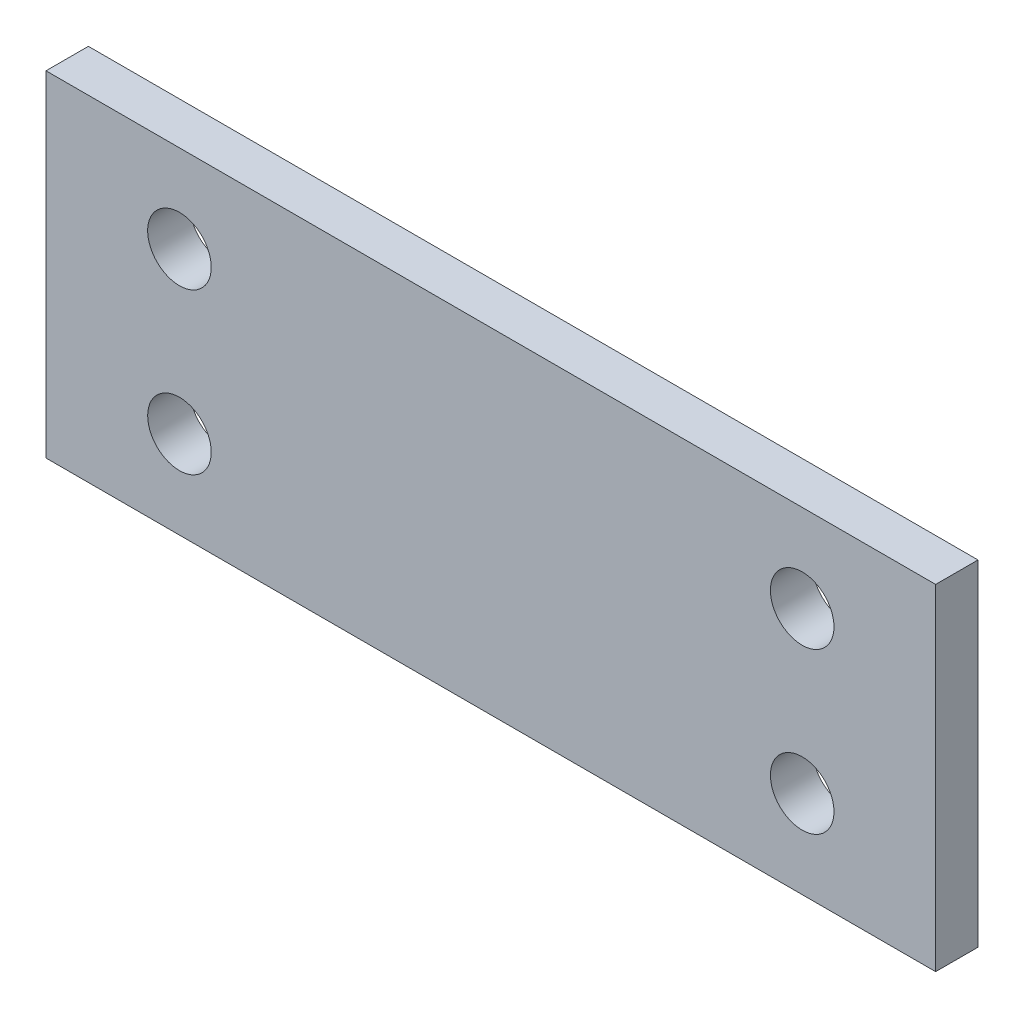
ISO-10303-21;
HEADER;
FILE_DESCRIPTION(('STEP AP214'),'2;1');
FILE_NAME('part.step','',(''),(''),'','','');
FILE_SCHEMA(('AUTOMOTIVE_DESIGN { 1 0 10303 214 1 1 1 1 }'));
ENDSEC;
DATA;
#1=APPLICATION_CONTEXT('core data for automotive mechanical design processes');
#2=APPLICATION_PROTOCOL_DEFINITION('international standard','automotive_design',2000,#1);
#3=PRODUCT_CONTEXT('',#1,'mechanical');
#4=PRODUCT('Part','Part','',(#3));
#5=PRODUCT_RELATED_PRODUCT_CATEGORY('part','',(#4));
#6=PRODUCT_DEFINITION_FORMATION('','',#4);
#7=PRODUCT_DEFINITION_CONTEXT('part definition',#1,'design');
#8=PRODUCT_DEFINITION('design','',#6,#7);
#9=PRODUCT_DEFINITION_SHAPE('','',#8);
#10=(LENGTH_UNIT() NAMED_UNIT(*) SI_UNIT(.MILLI.,.METRE.));
#11=(NAMED_UNIT(*) PLANE_ANGLE_UNIT() SI_UNIT($,.RADIAN.));
#12=(NAMED_UNIT(*) SI_UNIT($,.STERADIAN.) SOLID_ANGLE_UNIT());
#13=UNCERTAINTY_MEASURE_WITH_UNIT(LENGTH_MEASURE(1.E-05),#10,'distance_accuracy_value','');
#14=(GEOMETRIC_REPRESENTATION_CONTEXT(3) GLOBAL_UNCERTAINTY_ASSIGNED_CONTEXT((#13)) GLOBAL_UNIT_ASSIGNED_CONTEXT((#10,
#11,#12)) REPRESENTATION_CONTEXT('',''));
#15=CARTESIAN_POINT('',(0.,0.,0.));
#16=DIRECTION('',(0.,0.,1.));
#17=DIRECTION('',(1.,0.,0.));
#18=AXIS2_PLACEMENT_3D('',#15,#16,#17);
#19=CARTESIAN_POINT('',(-100.,25.4,9.525));
#20=DIRECTION('',(1.,0.,0.));
#21=DIRECTION('',(0.,1.,0.));
#22=AXIS2_PLACEMENT_3D('',#19,#20,#21);
#23=PLANE('',#22);
#24=DIRECTION('',(0.,-1.,0.));
#25=VECTOR('',#24,1.);
#26=CARTESIAN_POINT('',(-100.,25.4,0.));
#27=LINE('',#26,#25);
#28=CARTESIAN_POINT('',(-100.,25.4,0.));
#29=VERTEX_POINT('',#28);
#30=CARTESIAN_POINT('',(-100.,-50.,0.));
#31=VERTEX_POINT('',#30);
#32=EDGE_CURVE('E101',#29,#31,#27,.T.);
#33=ORIENTED_EDGE('',*,*,#32,.T.);
#34=DIRECTION('',(0.,0.,-1.));
#35=VECTOR('',#34,1.);
#36=CARTESIAN_POINT('',(-100.,-50.,9.525));
#37=LINE('',#36,#35);
#38=CARTESIAN_POINT('',(-100.,-50.,9.525));
#39=VERTEX_POINT('',#38);
#40=EDGE_CURVE('E11',#39,#31,#37,.T.);
#41=ORIENTED_EDGE('',*,*,#40,.F.);
#42=DIRECTION('',(0.,-1.,0.));
#43=VECTOR('',#42,1.);
#44=CARTESIAN_POINT('',(-100.,25.4,9.525));
#45=LINE('',#44,#43);
#46=CARTESIAN_POINT('',(-100.,25.4,9.525));
#47=VERTEX_POINT('',#46);
#48=EDGE_CURVE('E88',#47,#39,#45,.T.);
#49=ORIENTED_EDGE('',*,*,#48,.F.);
#50=DIRECTION('',(0.,0.,-1.));
#51=VECTOR('',#50,1.);
#52=CARTESIAN_POINT('',(-100.,25.4,9.525));
#53=LINE('',#52,#51);
#54=EDGE_CURVE('E97',#47,#29,#53,.T.);
#55=ORIENTED_EDGE('',*,*,#54,.T.);
#56=EDGE_LOOP('',(#33,#41,#49,#55));
#57=FACE_BOUND('',#56,.T.);
#58=ADVANCED_FACE('F35',(#57),#23,.F.);
#59=CARTESIAN_POINT('',(-100.,-50.,9.525));
#60=DIRECTION('',(0.,1.,0.));
#61=DIRECTION('',(0.,0.,1.));
#62=AXIS2_PLACEMENT_3D('',#59,#60,#61);
#63=PLANE('',#62);
#64=DIRECTION('',(1.,0.,0.));
#65=VECTOR('',#64,1.);
#66=CARTESIAN_POINT('',(-100.,-50.,0.));
#67=LINE('',#66,#65);
#68=CARTESIAN_POINT('',(100.,-50.,0.));
#69=VERTEX_POINT('',#68);
#70=EDGE_CURVE('E92',#31,#69,#67,.T.);
#71=ORIENTED_EDGE('',*,*,#70,.T.);
#72=DIRECTION('',(0.,0.,-1.));
#73=VECTOR('',#72,1.);
#74=CARTESIAN_POINT('',(100.,-50.,9.525));
#75=LINE('',#74,#73);
#76=CARTESIAN_POINT('',(100.,-50.,9.525));
#77=VERTEX_POINT('',#76);
#78=EDGE_CURVE('E44',#77,#69,#75,.T.);
#79=ORIENTED_EDGE('',*,*,#78,.F.);
#80=DIRECTION('',(1.,0.,0.));
#81=VECTOR('',#80,1.);
#82=CARTESIAN_POINT('',(-100.,-50.,9.525));
#83=LINE('',#82,#81);
#84=EDGE_CURVE('E83',#39,#77,#83,.T.);
#85=ORIENTED_EDGE('',*,*,#84,.F.);
#86=ORIENTED_EDGE('',*,*,#40,.T.);
#87=EDGE_LOOP('',(#71,#79,#85,#86));
#88=FACE_BOUND('',#87,.T.);
#89=ADVANCED_FACE('F91',(#88),#63,.F.);
#90=CARTESIAN_POINT('',(100.,-50.,9.525));
#91=DIRECTION('',(-1.,0.,0.));
#92=DIRECTION('',(0.,-1.,0.));
#93=AXIS2_PLACEMENT_3D('',#90,#91,#92);
#94=PLANE('',#93);
#95=DIRECTION('',(0.,1.,0.));
#96=VECTOR('',#95,1.);
#97=CARTESIAN_POINT('',(100.,-50.,0.));
#98=LINE('',#97,#96);
#99=CARTESIAN_POINT('',(100.,25.4,0.));
#100=VERTEX_POINT('',#99);
#101=EDGE_CURVE('E70',#69,#100,#98,.T.);
#102=ORIENTED_EDGE('',*,*,#101,.T.);
#103=DIRECTION('',(0.,0.,-1.));
#104=VECTOR('',#103,1.);
#105=CARTESIAN_POINT('',(100.,25.4,9.525));
#106=LINE('',#105,#104);
#107=CARTESIAN_POINT('',(100.,25.4,9.525));
#108=VERTEX_POINT('',#107);
#109=EDGE_CURVE('E93',#108,#100,#106,.T.);
#110=ORIENTED_EDGE('',*,*,#109,.F.);
#111=DIRECTION('',(0.,1.,0.));
#112=VECTOR('',#111,1.);
#113=CARTESIAN_POINT('',(100.,-50.,9.525));
#114=LINE('',#113,#112);
#115=EDGE_CURVE('E86',#77,#108,#114,.T.);
#116=ORIENTED_EDGE('',*,*,#115,.F.);
#117=ORIENTED_EDGE('',*,*,#78,.T.);
#118=EDGE_LOOP('',(#102,#110,#116,#117));
#119=FACE_BOUND('',#118,.T.);
#120=ADVANCED_FACE('F95',(#119),#94,.F.);
#121=CARTESIAN_POINT('',(-100.,25.4,9.525));
#122=DIRECTION('',(0.,-1.,0.));
#123=DIRECTION('',(1.,0.,0.));
#124=AXIS2_PLACEMENT_3D('',#121,#122,#123);
#125=PLANE('',#124);
#126=DIRECTION('',(-1.,0.,0.));
#127=VECTOR('',#126,1.);
#128=CARTESIAN_POINT('',(-100.,25.4,0.));
#129=LINE('',#128,#127);
#130=EDGE_CURVE('E76',#100,#29,#129,.T.);
#131=ORIENTED_EDGE('',*,*,#130,.T.);
#132=ORIENTED_EDGE('',*,*,#54,.F.);
#133=DIRECTION('',(-1.,0.,0.));
#134=VECTOR('',#133,1.);
#135=CARTESIAN_POINT('',(-100.,25.4,9.525));
#136=LINE('',#135,#134);
#137=EDGE_CURVE('E53',#108,#47,#136,.T.);
#138=ORIENTED_EDGE('',*,*,#137,.F.);
#139=ORIENTED_EDGE('',*,*,#109,.T.);
#140=EDGE_LOOP('',(#131,#132,#138,#139));
#141=FACE_BOUND('',#140,.T.);
#142=ADVANCED_FACE('F143',(#141),#125,.F.);
#143=CARTESIAN_POINT('',(0.,0.,9.525));
#144=DIRECTION('',(0.,0.,1.));
#145=DIRECTION('',(1.,0.,0.));
#146=AXIS2_PLACEMENT_3D('',#143,#144,#145);
#147=PLANE('',#146);
#148=CARTESIAN_POINT('',(-70.,-30.3,9.525));
#149=DIRECTION('',(0.,0.,1.));
#150=DIRECTION('',(-1.,0.,0.));
#151=AXIS2_PLACEMENT_3D('',#148,#149,#150);
#152=CIRCLE('',#151,7.14375);
#153=CARTESIAN_POINT('',(-77.14375,-30.3,9.525));
#154=VERTEX_POINT('',#153);
#155=EDGE_CURVE('E116',#154,#154,#152,.T.);
#156=ORIENTED_EDGE('',*,*,#155,.F.);
#157=EDGE_LOOP('',(#156));
#158=FACE_BOUND('',#157,.T.);
#159=CARTESIAN_POINT('',(70.,-30.3,9.525));
#160=DIRECTION('',(0.,0.,1.));
#161=DIRECTION('',(1.,0.,0.));
#162=AXIS2_PLACEMENT_3D('',#159,#160,#161);
#163=CIRCLE('',#162,7.14375);
#164=CARTESIAN_POINT('',(77.14375,-30.3,9.525));
#165=VERTEX_POINT('',#164);
#166=EDGE_CURVE('E131',#165,#165,#163,.T.);
#167=ORIENTED_EDGE('',*,*,#166,.F.);
#168=EDGE_LOOP('',(#167));
#169=FACE_BOUND('',#168,.T.);
#170=CARTESIAN_POINT('',(70.,5.70000000000002,9.525));
#171=DIRECTION('',(0.,0.,1.));
#172=DIRECTION('',(-1.,0.,0.));
#173=AXIS2_PLACEMENT_3D('',#170,#171,#172);
#174=CIRCLE('',#173,7.14375);
#175=CARTESIAN_POINT('',(62.85625,5.70000000000002,9.525));
#176=VERTEX_POINT('',#175);
#177=EDGE_CURVE('E128',#176,#176,#174,.T.);
#178=ORIENTED_EDGE('',*,*,#177,.F.);
#179=EDGE_LOOP('',(#178));
#180=FACE_BOUND('',#179,.T.);
#181=CARTESIAN_POINT('',(-70.,5.69999999999999,9.525));
#182=DIRECTION('',(0.,0.,1.));
#183=DIRECTION('',(1.,0.,0.));
#184=AXIS2_PLACEMENT_3D('',#181,#182,#183);
#185=CIRCLE('',#184,7.14375);
#186=CARTESIAN_POINT('',(-62.85625,5.69999999999999,9.525));
#187=VERTEX_POINT('',#186);
#188=EDGE_CURVE('E112',#187,#187,#185,.T.);
#189=ORIENTED_EDGE('',*,*,#188,.F.);
#190=EDGE_LOOP('',(#189));
#191=FACE_BOUND('',#190,.T.);
#192=ORIENTED_EDGE('',*,*,#48,.T.);
#193=ORIENTED_EDGE('',*,*,#84,.T.);
#194=ORIENTED_EDGE('',*,*,#115,.T.);
#195=ORIENTED_EDGE('',*,*,#137,.T.);
#196=EDGE_LOOP('',(#192,#193,#194,#195));
#197=FACE_BOUND('',#196,.T.);
#198=ADVANCED_FACE('F84',(#158,#169,#180,#191,#197),#147,.T.);
#199=CARTESIAN_POINT('',(0.,0.,0.));
#200=DIRECTION('',(0.,0.,1.));
#201=DIRECTION('',(1.,0.,0.));
#202=AXIS2_PLACEMENT_3D('',#199,#200,#201);
#203=PLANE('',#202);
#204=CARTESIAN_POINT('',(-70.,-30.3,0.));
#205=DIRECTION('',(0.,0.,1.));
#206=DIRECTION('',(1.,0.,0.));
#207=AXIS2_PLACEMENT_3D('',#204,#205,#206);
#208=CIRCLE('',#207,7.14375);
#209=CARTESIAN_POINT('',(-62.85625,-30.3,0.));
#210=VERTEX_POINT('',#209);
#211=EDGE_CURVE('E38',#210,#210,#208,.T.);
#212=ORIENTED_EDGE('',*,*,#211,.T.);
#213=EDGE_LOOP('',(#212));
#214=FACE_BOUND('',#213,.T.);
#215=CARTESIAN_POINT('',(70.,-30.3,0.));
#216=DIRECTION('',(0.,0.,1.));
#217=DIRECTION('',(1.,0.,0.));
#218=AXIS2_PLACEMENT_3D('',#215,#216,#217);
#219=CIRCLE('',#218,7.14375);
#220=CARTESIAN_POINT('',(77.14375,-30.3,0.));
#221=VERTEX_POINT('',#220);
#222=EDGE_CURVE('E115',#221,#221,#219,.T.);
#223=ORIENTED_EDGE('',*,*,#222,.T.);
#224=EDGE_LOOP('',(#223));
#225=FACE_BOUND('',#224,.T.);
#226=CARTESIAN_POINT('',(70.,5.70000000000002,0.));
#227=DIRECTION('',(0.,0.,1.));
#228=DIRECTION('',(1.,0.,0.));
#229=AXIS2_PLACEMENT_3D('',#226,#227,#228);
#230=CIRCLE('',#229,7.14375);
#231=CARTESIAN_POINT('',(77.14375,5.70000000000002,0.));
#232=VERTEX_POINT('',#231);
#233=EDGE_CURVE('E113',#232,#232,#230,.T.);
#234=ORIENTED_EDGE('',*,*,#233,.T.);
#235=EDGE_LOOP('',(#234));
#236=FACE_BOUND('',#235,.T.);
#237=CARTESIAN_POINT('',(-70.,5.69999999999999,0.));
#238=DIRECTION('',(0.,0.,1.));
#239=DIRECTION('',(1.,0.,0.));
#240=AXIS2_PLACEMENT_3D('',#237,#238,#239);
#241=CIRCLE('',#240,7.14375);
#242=CARTESIAN_POINT('',(-62.85625,5.69999999999999,0.));
#243=VERTEX_POINT('',#242);
#244=EDGE_CURVE('E104',#243,#243,#241,.T.);
#245=ORIENTED_EDGE('',*,*,#244,.T.);
#246=EDGE_LOOP('',(#245));
#247=FACE_BOUND('',#246,.T.);
#248=ORIENTED_EDGE('',*,*,#32,.F.);
#249=ORIENTED_EDGE('',*,*,#130,.F.);
#250=ORIENTED_EDGE('',*,*,#101,.F.);
#251=ORIENTED_EDGE('',*,*,#70,.F.);
#252=EDGE_LOOP('',(#248,#249,#250,#251));
#253=FACE_BOUND('',#252,.T.);
#254=ADVANCED_FACE('F142',(#214,#225,#236,#247,#253),#203,.F.);
#255=CARTESIAN_POINT('',(-70.,5.69999999999999,-0.475));
#256=DIRECTION('',(0.,0.,1.));
#257=DIRECTION('',(1.,0.,0.));
#258=AXIS2_PLACEMENT_3D('',#255,#256,#257);
#259=CYLINDRICAL_SURFACE('',#258,7.14375);
#260=ORIENTED_EDGE('',*,*,#188,.T.);
#261=EDGE_LOOP('',(#260));
#262=FACE_BOUND('',#261,.T.);
#263=ORIENTED_EDGE('',*,*,#244,.F.);
#264=EDGE_LOOP('',(#263));
#265=FACE_BOUND('',#264,.T.);
#266=ADVANCED_FACE('F154',(#262,#265),#259,.F.);
#267=CARTESIAN_POINT('',(70.,5.70000000000002,-0.475));
#268=DIRECTION('',(0.,0.,1.));
#269=DIRECTION('',(1.,0.,0.));
#270=AXIS2_PLACEMENT_3D('',#267,#268,#269);
#271=CYLINDRICAL_SURFACE('',#270,7.14375);
#272=ORIENTED_EDGE('',*,*,#177,.T.);
#273=EDGE_LOOP('',(#272));
#274=FACE_BOUND('',#273,.T.);
#275=ORIENTED_EDGE('',*,*,#233,.F.);
#276=EDGE_LOOP('',(#275));
#277=FACE_BOUND('',#276,.T.);
#278=ADVANCED_FACE('F150',(#274,#277),#271,.F.);
#279=CARTESIAN_POINT('',(70.,-30.3,-0.475));
#280=DIRECTION('',(0.,0.,1.));
#281=DIRECTION('',(1.,0.,0.));
#282=AXIS2_PLACEMENT_3D('',#279,#280,#281);
#283=CYLINDRICAL_SURFACE('',#282,7.14375);
#284=ORIENTED_EDGE('',*,*,#166,.T.);
#285=EDGE_LOOP('',(#284));
#286=FACE_BOUND('',#285,.T.);
#287=ORIENTED_EDGE('',*,*,#222,.F.);
#288=EDGE_LOOP('',(#287));
#289=FACE_BOUND('',#288,.T.);
#290=ADVANCED_FACE('F153',(#286,#289),#283,.F.);
#291=CARTESIAN_POINT('',(-70.,-30.3,-0.475));
#292=DIRECTION('',(0.,0.,1.));
#293=DIRECTION('',(1.,0.,0.));
#294=AXIS2_PLACEMENT_3D('',#291,#292,#293);
#295=CYLINDRICAL_SURFACE('',#294,7.14375);
#296=ORIENTED_EDGE('',*,*,#155,.T.);
#297=EDGE_LOOP('',(#296));
#298=FACE_BOUND('',#297,.T.);
#299=ORIENTED_EDGE('',*,*,#211,.F.);
#300=EDGE_LOOP('',(#299));
#301=FACE_BOUND('',#300,.T.);
#302=ADVANCED_FACE('F137',(#298,#301),#295,.F.);
#303=CLOSED_SHELL('',(#58,#89,#120,#142,#198,#254,#266,#278,#290,#302));
#304=MANIFOLD_SOLID_BREP('B2',#303);
#305=ADVANCED_BREP_SHAPE_REPRESENTATION('',(#18,#304),#14);
#306=SHAPE_DEFINITION_REPRESENTATION(#9,#305);
ENDSEC;
END-ISO-10303-21;
